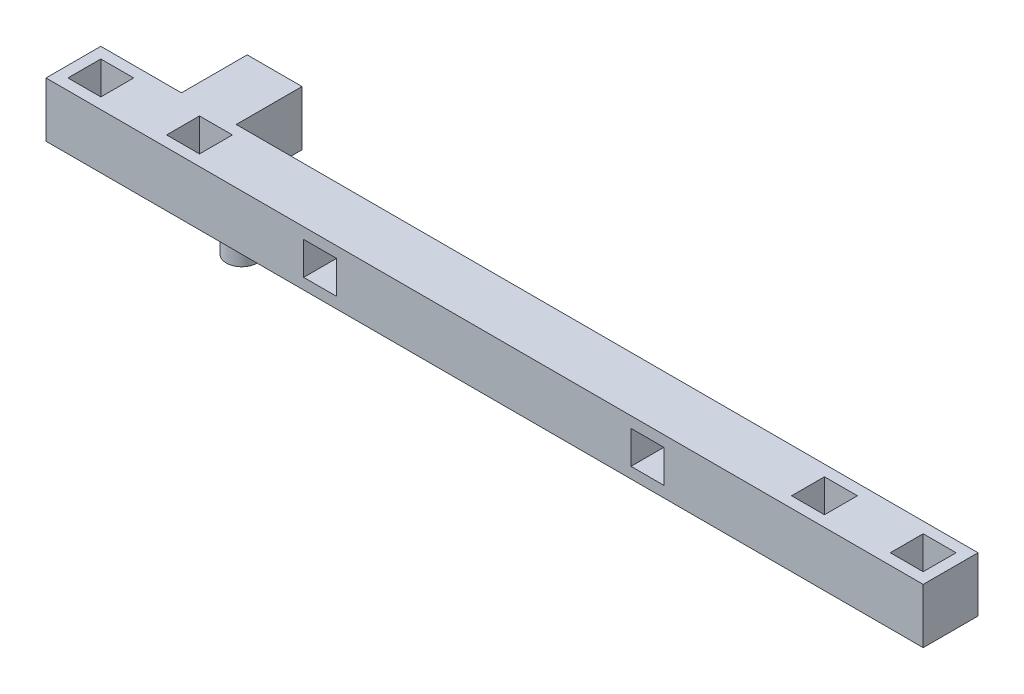
ISO-10303-21;
HEADER;
FILE_DESCRIPTION(('STEP AP214'),'2;1');
FILE_NAME('part.step','',(''),(''),'','','');
FILE_SCHEMA(('AUTOMOTIVE_DESIGN { 1 0 10303 214 1 1 1 1 }'));
ENDSEC;
DATA;
#1=APPLICATION_CONTEXT('core data for automotive mechanical design processes');
#2=APPLICATION_PROTOCOL_DEFINITION('international standard','automotive_design',2000,#1);
#3=PRODUCT_CONTEXT('',#1,'mechanical');
#4=PRODUCT('Part','Part','',(#3));
#5=PRODUCT_RELATED_PRODUCT_CATEGORY('part','',(#4));
#6=PRODUCT_DEFINITION_FORMATION('','',#4);
#7=PRODUCT_DEFINITION_CONTEXT('part definition',#1,'design');
#8=PRODUCT_DEFINITION('design','',#6,#7);
#9=PRODUCT_DEFINITION_SHAPE('','',#8);
#10=(LENGTH_UNIT() NAMED_UNIT(*) SI_UNIT(.MILLI.,.METRE.));
#11=(NAMED_UNIT(*) PLANE_ANGLE_UNIT() SI_UNIT($,.RADIAN.));
#12=(NAMED_UNIT(*) SI_UNIT($,.STERADIAN.) SOLID_ANGLE_UNIT());
#13=UNCERTAINTY_MEASURE_WITH_UNIT(LENGTH_MEASURE(1.E-05),#10,'distance_accuracy_value','');
#14=(GEOMETRIC_REPRESENTATION_CONTEXT(3) GLOBAL_UNCERTAINTY_ASSIGNED_CONTEXT((#13)) GLOBAL_UNIT_ASSIGNED_CONTEXT((#10,
#11,#12)) REPRESENTATION_CONTEXT('',''));
#15=CARTESIAN_POINT('',(0.,0.,0.));
#16=DIRECTION('',(0.,0.,1.));
#17=DIRECTION('',(1.,0.,0.));
#18=AXIS2_PLACEMENT_3D('',#15,#16,#17);
#19=CARTESIAN_POINT('',(0.,0.,0.));
#20=DIRECTION('',(0.,0.,-1.));
#21=DIRECTION('',(-1.,0.,0.));
#22=AXIS2_PLACEMENT_3D('',#19,#20,#21);
#23=PLANE('',#22);
#24=DIRECTION('',(0.,-1.,0.));
#25=VECTOR('',#24,1.);
#26=CARTESIAN_POINT('',(12.35,5.,0.));
#27=LINE('',#26,#25);
#28=CARTESIAN_POINT('',(12.35,5.,0.));
#29=VERTEX_POINT('',#28);
#30=CARTESIAN_POINT('',(12.35,0.,0.));
#31=VERTEX_POINT('',#30);
#32=EDGE_CURVE('E263',#29,#31,#27,.T.);
#33=ORIENTED_EDGE('',*,*,#32,.F.);
#34=DIRECTION('',(-1.,0.,0.));
#35=VECTOR('',#34,1.);
#36=CARTESIAN_POINT('',(0.,5.,0.));
#37=LINE('',#36,#35);
#38=CARTESIAN_POINT('',(80.,5.,0.));
#39=VERTEX_POINT('',#38);
#40=EDGE_CURVE('E464',#39,#29,#37,.T.);
#41=ORIENTED_EDGE('',*,*,#40,.F.);
#42=DIRECTION('',(0.,1.,0.));
#43=VECTOR('',#42,1.);
#44=CARTESIAN_POINT('',(80.,0.,0.));
#45=LINE('',#44,#43);
#46=CARTESIAN_POINT('',(80.,0.,0.));
#47=VERTEX_POINT('',#46);
#48=EDGE_CURVE('E475',#47,#39,#45,.T.);
#49=ORIENTED_EDGE('',*,*,#48,.F.);
#50=DIRECTION('',(1.,0.,0.));
#51=VECTOR('',#50,1.);
#52=CARTESIAN_POINT('',(0.,0.,0.));
#53=LINE('',#52,#51);
#54=EDGE_CURVE('E48',#31,#47,#53,.T.);
#55=ORIENTED_EDGE('',*,*,#54,.F.);
#56=EDGE_LOOP('',(#33,#41,#49,#55));
#57=FACE_BOUND('',#56,.T.);
#58=DIRECTION('',(-1.,0.,0.));
#59=VECTOR('',#58,1.);
#60=CARTESIAN_POINT('',(53.35,4.,0.));
#61=LINE('',#60,#59);
#62=CARTESIAN_POINT('',(56.35,4.,0.));
#63=VERTEX_POINT('',#62);
#64=CARTESIAN_POINT('',(53.35,4.,0.));
#65=VERTEX_POINT('',#64);
#66=EDGE_CURVE('E432',#63,#65,#61,.T.);
#67=ORIENTED_EDGE('',*,*,#66,.T.);
#68=DIRECTION('',(0.,-1.,0.));
#69=VECTOR('',#68,1.);
#70=CARTESIAN_POINT('',(53.35,4.,0.));
#71=LINE('',#70,#69);
#72=CARTESIAN_POINT('',(53.35,1.,0.));
#73=VERTEX_POINT('',#72);
#74=EDGE_CURVE('E428',#65,#73,#71,.T.);
#75=ORIENTED_EDGE('',*,*,#74,.T.);
#76=DIRECTION('',(1.,0.,0.));
#77=VECTOR('',#76,1.);
#78=CARTESIAN_POINT('',(53.35,1.,0.));
#79=LINE('',#78,#77);
#80=CARTESIAN_POINT('',(56.35,1.,0.));
#81=VERTEX_POINT('',#80);
#82=EDGE_CURVE('E442',#73,#81,#79,.T.);
#83=ORIENTED_EDGE('',*,*,#82,.T.);
#84=DIRECTION('',(0.,1.,0.));
#85=VECTOR('',#84,1.);
#86=CARTESIAN_POINT('',(56.35,4.,0.));
#87=LINE('',#86,#85);
#88=EDGE_CURVE('E445',#81,#63,#87,.T.);
#89=ORIENTED_EDGE('',*,*,#88,.T.);
#90=EDGE_LOOP('',(#67,#75,#83,#89));
#91=FACE_BOUND('',#90,.T.);
#92=DIRECTION('',(-1.,0.,0.));
#93=VECTOR('',#92,1.);
#94=CARTESIAN_POINT('',(23.5,4.,0.));
#95=LINE('',#94,#93);
#96=CARTESIAN_POINT('',(26.5,4.,0.));
#97=VERTEX_POINT('',#96);
#98=CARTESIAN_POINT('',(23.5,4.,0.));
#99=VERTEX_POINT('',#98);
#100=EDGE_CURVE('E401',#97,#99,#95,.T.);
#101=ORIENTED_EDGE('',*,*,#100,.T.);
#102=DIRECTION('',(0.,-1.,0.));
#103=VECTOR('',#102,1.);
#104=CARTESIAN_POINT('',(23.5,4.,0.));
#105=LINE('',#104,#103);
#106=CARTESIAN_POINT('',(23.5,1.,0.));
#107=VERTEX_POINT('',#106);
#108=EDGE_CURVE('E299',#99,#107,#105,.T.);
#109=ORIENTED_EDGE('',*,*,#108,.T.);
#110=DIRECTION('',(1.,0.,0.));
#111=VECTOR('',#110,1.);
#112=CARTESIAN_POINT('',(23.5,1.,0.));
#113=LINE('',#112,#111);
#114=CARTESIAN_POINT('',(26.5,1.,0.));
#115=VERTEX_POINT('',#114);
#116=EDGE_CURVE('E411',#107,#115,#113,.T.);
#117=ORIENTED_EDGE('',*,*,#116,.T.);
#118=DIRECTION('',(0.,1.,0.));
#119=VECTOR('',#118,1.);
#120=CARTESIAN_POINT('',(26.5,4.,0.));
#121=LINE('',#120,#119);
#122=EDGE_CURVE('E414',#115,#97,#121,.T.);
#123=ORIENTED_EDGE('',*,*,#122,.T.);
#124=EDGE_LOOP('',(#101,#109,#117,#123));
#125=FACE_BOUND('',#124,.T.);
#126=ADVANCED_FACE('F33',(#57,#91,#125),#23,.T.);
#127=CARTESIAN_POINT('',(0.,0.,5.));
#128=DIRECTION('',(0.,0.,-1.));
#129=DIRECTION('',(-1.,0.,0.));
#130=AXIS2_PLACEMENT_3D('',#127,#128,#129);
#131=PLANE('',#130);
#132=DIRECTION('',(0.,-1.,0.));
#133=VECTOR('',#132,1.);
#134=CARTESIAN_POINT('',(53.35,4.,5.));
#135=LINE('',#134,#133);
#136=CARTESIAN_POINT('',(53.35,4.,5.));
#137=VERTEX_POINT('',#136);
#138=CARTESIAN_POINT('',(53.35,1.,5.));
#139=VERTEX_POINT('',#138);
#140=EDGE_CURVE('E429',#137,#139,#135,.T.);
#141=ORIENTED_EDGE('',*,*,#140,.F.);
#142=DIRECTION('',(-1.,0.,0.));
#143=VECTOR('',#142,1.);
#144=CARTESIAN_POINT('',(53.35,4.,5.));
#145=LINE('',#144,#143);
#146=CARTESIAN_POINT('',(56.35,4.,5.));
#147=VERTEX_POINT('',#146);
#148=EDGE_CURVE('E437',#147,#137,#145,.T.);
#149=ORIENTED_EDGE('',*,*,#148,.F.);
#150=DIRECTION('',(0.,1.,0.));
#151=VECTOR('',#150,1.);
#152=CARTESIAN_POINT('',(56.35,4.,5.));
#153=LINE('',#152,#151);
#154=CARTESIAN_POINT('',(56.35,1.,5.));
#155=VERTEX_POINT('',#154);
#156=EDGE_CURVE('E434',#155,#147,#153,.T.);
#157=ORIENTED_EDGE('',*,*,#156,.F.);
#158=DIRECTION('',(1.,0.,0.));
#159=VECTOR('',#158,1.);
#160=CARTESIAN_POINT('',(53.35,1.,5.));
#161=LINE('',#160,#159);
#162=EDGE_CURVE('E431',#139,#155,#161,.T.);
#163=ORIENTED_EDGE('',*,*,#162,.F.);
#164=EDGE_LOOP('',(#141,#149,#157,#163));
#165=FACE_BOUND('',#164,.T.);
#166=DIRECTION('',(0.,-1.,0.));
#167=VECTOR('',#166,1.);
#168=CARTESIAN_POINT('',(0.,0.,5.));
#169=LINE('',#168,#167);
#170=CARTESIAN_POINT('',(0.,5.,5.));
#171=VERTEX_POINT('',#170);
#172=CARTESIAN_POINT('',(0.,0.,5.));
#173=VERTEX_POINT('',#172);
#174=EDGE_CURVE('E460',#171,#173,#169,.T.);
#175=ORIENTED_EDGE('',*,*,#174,.T.);
#176=DIRECTION('',(1.,0.,0.));
#177=VECTOR('',#176,1.);
#178=CARTESIAN_POINT('',(0.,0.,5.));
#179=LINE('',#178,#177);
#180=CARTESIAN_POINT('',(80.,0.,5.));
#181=VERTEX_POINT('',#180);
#182=EDGE_CURVE('E463',#173,#181,#179,.T.);
#183=ORIENTED_EDGE('',*,*,#182,.T.);
#184=DIRECTION('',(0.,1.,0.));
#185=VECTOR('',#184,1.);
#186=CARTESIAN_POINT('',(80.,0.,5.));
#187=LINE('',#186,#185);
#188=CARTESIAN_POINT('',(80.,5.,5.));
#189=VERTEX_POINT('',#188);
#190=EDGE_CURVE('E466',#181,#189,#187,.T.);
#191=ORIENTED_EDGE('',*,*,#190,.T.);
#192=DIRECTION('',(-1.,0.,0.));
#193=VECTOR('',#192,1.);
#194=CARTESIAN_POINT('',(0.,5.,5.));
#195=LINE('',#194,#193);
#196=EDGE_CURVE('E468',#189,#171,#195,.T.);
#197=ORIENTED_EDGE('',*,*,#196,.T.);
#198=EDGE_LOOP('',(#175,#183,#191,#197));
#199=FACE_BOUND('',#198,.T.);
#200=DIRECTION('',(0.,-1.,0.));
#201=VECTOR('',#200,1.);
#202=CARTESIAN_POINT('',(23.5,4.,5.));
#203=LINE('',#202,#201);
#204=CARTESIAN_POINT('',(23.5,4.,5.));
#205=VERTEX_POINT('',#204);
#206=CARTESIAN_POINT('',(23.5,1.,5.));
#207=VERTEX_POINT('',#206);
#208=EDGE_CURVE('E398',#205,#207,#203,.T.);
#209=ORIENTED_EDGE('',*,*,#208,.F.);
#210=DIRECTION('',(-1.,0.,0.));
#211=VECTOR('',#210,1.);
#212=CARTESIAN_POINT('',(23.5,4.,5.));
#213=LINE('',#212,#211);
#214=CARTESIAN_POINT('',(26.5,4.,5.));
#215=VERTEX_POINT('',#214);
#216=EDGE_CURVE('E406',#215,#205,#213,.T.);
#217=ORIENTED_EDGE('',*,*,#216,.F.);
#218=DIRECTION('',(0.,1.,0.));
#219=VECTOR('',#218,1.);
#220=CARTESIAN_POINT('',(26.5,4.,5.));
#221=LINE('',#220,#219);
#222=CARTESIAN_POINT('',(26.5,1.,5.));
#223=VERTEX_POINT('',#222);
#224=EDGE_CURVE('E403',#223,#215,#221,.T.);
#225=ORIENTED_EDGE('',*,*,#224,.F.);
#226=DIRECTION('',(1.,0.,0.));
#227=VECTOR('',#226,1.);
#228=CARTESIAN_POINT('',(23.5,1.,5.));
#229=LINE('',#228,#227);
#230=EDGE_CURVE('E400',#207,#223,#229,.T.);
#231=ORIENTED_EDGE('',*,*,#230,.F.);
#232=EDGE_LOOP('',(#209,#217,#225,#231));
#233=FACE_BOUND('',#232,.T.);
#234=ADVANCED_FACE('F564',(#165,#199,#233),#131,.F.);
#235=DIRECTION('',(0.,1.,0.));
#236=VECTOR('',#235,1.);
#237=CARTESIAN_POINT('',(7.35,5.,0.));
#238=LINE('',#237,#236);
#239=CARTESIAN_POINT('',(7.35,0.,0.));
#240=VERTEX_POINT('',#239);
#241=CARTESIAN_POINT('',(7.35,5.,0.));
#242=VERTEX_POINT('',#241);
#243=EDGE_CURVE('E56',#240,#242,#238,.T.);
#244=ORIENTED_EDGE('',*,*,#243,.F.);
#245=CARTESIAN_POINT('',(0.,0.,0.));
#246=VERTEX_POINT('',#245);
#247=EDGE_CURVE('E473',#246,#240,#53,.T.);
#248=ORIENTED_EDGE('',*,*,#247,.F.);
#249=DIRECTION('',(0.,-1.,0.));
#250=VECTOR('',#249,1.);
#251=CARTESIAN_POINT('',(0.,0.,0.));
#252=LINE('',#251,#250);
#253=CARTESIAN_POINT('',(0.,5.,0.));
#254=VERTEX_POINT('',#253);
#255=EDGE_CURVE('E459',#254,#246,#252,.T.);
#256=ORIENTED_EDGE('',*,*,#255,.F.);
#257=EDGE_CURVE('E477',#242,#254,#37,.T.);
#258=ORIENTED_EDGE('',*,*,#257,.F.);
#259=EDGE_LOOP('',(#244,#248,#256,#258));
#260=FACE_BOUND('',#259,.T.);
#261=ADVANCED_FACE('F494',(#260),#23,.T.);
#262=CARTESIAN_POINT('',(0.,0.,5.));
#263=DIRECTION('',(1.,0.,0.));
#264=DIRECTION('',(0.,0.,-1.));
#265=AXIS2_PLACEMENT_3D('',#262,#263,#264);
#266=PLANE('',#265);
#267=ORIENTED_EDGE('',*,*,#255,.T.);
#268=DIRECTION('',(0.,0.,-1.));
#269=VECTOR('',#268,1.);
#270=CARTESIAN_POINT('',(0.,0.,5.));
#271=LINE('',#270,#269);
#272=EDGE_CURVE('E41',#173,#246,#271,.T.);
#273=ORIENTED_EDGE('',*,*,#272,.F.);
#274=ORIENTED_EDGE('',*,*,#174,.F.);
#275=DIRECTION('',(0.,0.,-1.));
#276=VECTOR('',#275,1.);
#277=CARTESIAN_POINT('',(0.,5.,5.));
#278=LINE('',#277,#276);
#279=EDGE_CURVE('E470',#171,#254,#278,.T.);
#280=ORIENTED_EDGE('',*,*,#279,.T.);
#281=EDGE_LOOP('',(#267,#273,#274,#280));
#282=FACE_BOUND('',#281,.T.);
#283=ADVANCED_FACE('F35',(#282),#266,.F.);
#284=CARTESIAN_POINT('',(0.,0.,5.));
#285=DIRECTION('',(0.,1.,0.));
#286=DIRECTION('',(0.,0.,1.));
#287=AXIS2_PLACEMENT_3D('',#284,#285,#286);
#288=PLANE('',#287);
#289=CARTESIAN_POINT('',(9.85,0.,-3.));
#290=DIRECTION('',(0.,1.,0.));
#291=DIRECTION('',(0.,0.,1.));
#292=AXIS2_PLACEMENT_3D('',#289,#290,#291);
#293=CIRCLE('',#292,1.4);
#294=CARTESIAN_POINT('',(9.85,0.,-1.6));
#295=VERTEX_POINT('',#294);
#296=EDGE_CURVE('E11',#295,#295,#293,.F.);
#297=ORIENTED_EDGE('',*,*,#296,.F.);
#298=EDGE_LOOP('',(#297));
#299=FACE_BOUND('',#298,.T.);
#300=DIRECTION('',(-1.,0.,0.));
#301=VECTOR('',#300,1.);
#302=CARTESIAN_POINT('',(76.,0.,1.));
#303=LINE('',#302,#301);
#304=CARTESIAN_POINT('',(79.,0.,1.));
#305=VERTEX_POINT('',#304);
#306=CARTESIAN_POINT('',(76.,0.,1.));
#307=VERTEX_POINT('',#306);
#308=EDGE_CURVE('E282',#305,#307,#303,.T.);
#309=ORIENTED_EDGE('',*,*,#308,.T.);
#310=DIRECTION('',(0.,0.,1.));
#311=VECTOR('',#310,1.);
#312=CARTESIAN_POINT('',(76.,0.,1.));
#313=LINE('',#312,#311);
#314=CARTESIAN_POINT('',(76.,0.,4.));
#315=VERTEX_POINT('',#314);
#316=EDGE_CURVE('E272',#307,#315,#313,.T.);
#317=ORIENTED_EDGE('',*,*,#316,.T.);
#318=DIRECTION('',(1.,0.,0.));
#319=VECTOR('',#318,1.);
#320=CARTESIAN_POINT('',(76.,0.,4.));
#321=LINE('',#320,#319);
#322=CARTESIAN_POINT('',(79.,0.,4.));
#323=VERTEX_POINT('',#322);
#324=EDGE_CURVE('E275',#315,#323,#321,.T.);
#325=ORIENTED_EDGE('',*,*,#324,.T.);
#326=DIRECTION('',(0.,0.,-1.));
#327=VECTOR('',#326,1.);
#328=CARTESIAN_POINT('',(79.,0.,1.));
#329=LINE('',#328,#327);
#330=EDGE_CURVE('E279',#323,#305,#329,.T.);
#331=ORIENTED_EDGE('',*,*,#330,.T.);
#332=EDGE_LOOP('',(#309,#317,#325,#331));
#333=FACE_BOUND('',#332,.T.);
#334=DIRECTION('',(-1.,0.,0.));
#335=VECTOR('',#334,1.);
#336=CARTESIAN_POINT('',(1.,0.,1.));
#337=LINE('',#336,#335);
#338=CARTESIAN_POINT('',(4.,0.,0.999999999999991));
#339=VERTEX_POINT('',#338);
#340=CARTESIAN_POINT('',(1.,0.,1.));
#341=VERTEX_POINT('',#340);
#342=EDGE_CURVE('E316',#339,#341,#337,.T.);
#343=ORIENTED_EDGE('',*,*,#342,.T.);
#344=DIRECTION('',(0.,0.,1.));
#345=VECTOR('',#344,1.);
#346=CARTESIAN_POINT('',(1.,0.,1.));
#347=LINE('',#346,#345);
#348=CARTESIAN_POINT('',(1.,0.,4.));
#349=VERTEX_POINT('',#348);
#350=EDGE_CURVE('E306',#341,#349,#347,.T.);
#351=ORIENTED_EDGE('',*,*,#350,.T.);
#352=DIRECTION('',(1.,0.,0.));
#353=VECTOR('',#352,1.);
#354=CARTESIAN_POINT('',(1.,0.,4.));
#355=LINE('',#354,#353);
#356=CARTESIAN_POINT('',(4.,0.,4.));
#357=VERTEX_POINT('',#356);
#358=EDGE_CURVE('E309',#349,#357,#355,.T.);
#359=ORIENTED_EDGE('',*,*,#358,.T.);
#360=DIRECTION('',(0.,0.,-1.));
#361=VECTOR('',#360,1.);
#362=CARTESIAN_POINT('',(4.,0.,0.999999999999991));
#363=LINE('',#362,#361);
#364=EDGE_CURVE('E313',#357,#339,#363,.T.);
#365=ORIENTED_EDGE('',*,*,#364,.T.);
#366=EDGE_LOOP('',(#343,#351,#359,#365));
#367=FACE_BOUND('',#366,.T.);
#368=DIRECTION('',(-1.,0.,0.));
#369=VECTOR('',#368,1.);
#370=CARTESIAN_POINT('',(10.,0.,1.));
#371=LINE('',#370,#369);
#372=CARTESIAN_POINT('',(13.,0.,1.));
#373=VERTEX_POINT('',#372);
#374=CARTESIAN_POINT('',(10.,0.,1.));
#375=VERTEX_POINT('',#374);
#376=EDGE_CURVE('E348',#373,#375,#371,.T.);
#377=ORIENTED_EDGE('',*,*,#376,.T.);
#378=DIRECTION('',(0.,0.,1.));
#379=VECTOR('',#378,1.);
#380=CARTESIAN_POINT('',(10.,0.,1.));
#381=LINE('',#380,#379);
#382=CARTESIAN_POINT('',(10.,0.,4.));
#383=VERTEX_POINT('',#382);
#384=EDGE_CURVE('E338',#375,#383,#381,.T.);
#385=ORIENTED_EDGE('',*,*,#384,.T.);
#386=DIRECTION('',(1.,0.,0.));
#387=VECTOR('',#386,1.);
#388=CARTESIAN_POINT('',(10.,0.,4.));
#389=LINE('',#388,#387);
#390=CARTESIAN_POINT('',(13.,0.,4.));
#391=VERTEX_POINT('',#390);
#392=EDGE_CURVE('E341',#383,#391,#389,.T.);
#393=ORIENTED_EDGE('',*,*,#392,.T.);
#394=DIRECTION('',(0.,0.,-1.));
#395=VECTOR('',#394,1.);
#396=CARTESIAN_POINT('',(13.,0.,1.));
#397=LINE('',#396,#395);
#398=EDGE_CURVE('E345',#391,#373,#397,.T.);
#399=ORIENTED_EDGE('',*,*,#398,.T.);
#400=EDGE_LOOP('',(#377,#385,#393,#399));
#401=FACE_BOUND('',#400,.T.);
#402=DIRECTION('',(-1.,0.,0.));
#403=VECTOR('',#402,1.);
#404=CARTESIAN_POINT('',(67.,0.,1.));
#405=LINE('',#404,#403);
#406=CARTESIAN_POINT('',(70.,0.,1.));
#407=VERTEX_POINT('',#406);
#408=CARTESIAN_POINT('',(67.,0.,1.));
#409=VERTEX_POINT('',#408);
#410=EDGE_CURVE('E380',#407,#409,#405,.T.);
#411=ORIENTED_EDGE('',*,*,#410,.T.);
#412=DIRECTION('',(0.,0.,1.));
#413=VECTOR('',#412,1.);
#414=CARTESIAN_POINT('',(67.,0.,1.));
#415=LINE('',#414,#413);
#416=CARTESIAN_POINT('',(67.,0.,4.));
#417=VERTEX_POINT('',#416);
#418=EDGE_CURVE('E370',#409,#417,#415,.T.);
#419=ORIENTED_EDGE('',*,*,#418,.T.);
#420=DIRECTION('',(1.,0.,0.));
#421=VECTOR('',#420,1.);
#422=CARTESIAN_POINT('',(67.,0.,4.));
#423=LINE('',#422,#421);
#424=CARTESIAN_POINT('',(70.,0.,4.));
#425=VERTEX_POINT('',#424);
#426=EDGE_CURVE('E373',#417,#425,#423,.T.);
#427=ORIENTED_EDGE('',*,*,#426,.T.);
#428=DIRECTION('',(0.,0.,-1.));
#429=VECTOR('',#428,1.);
#430=CARTESIAN_POINT('',(70.,0.,1.));
#431=LINE('',#430,#429);
#432=EDGE_CURVE('E377',#425,#407,#431,.T.);
#433=ORIENTED_EDGE('',*,*,#432,.T.);
#434=EDGE_LOOP('',(#411,#419,#427,#433));
#435=FACE_BOUND('',#434,.T.);
#436=ORIENTED_EDGE('',*,*,#247,.T.);
#437=DIRECTION('',(0.,0.,1.));
#438=VECTOR('',#437,1.);
#439=CARTESIAN_POINT('',(7.35,0.,-6.));
#440=LINE('',#439,#438);
#441=CARTESIAN_POINT('',(7.35,0.,-6.));
#442=VERTEX_POINT('',#441);
#443=EDGE_CURVE('E248',#442,#240,#440,.T.);
#444=ORIENTED_EDGE('',*,*,#443,.F.);
#445=DIRECTION('',(-1.,0.,0.));
#446=VECTOR('',#445,1.);
#447=CARTESIAN_POINT('',(12.35,0.,-6.));
#448=LINE('',#447,#446);
#449=CARTESIAN_POINT('',(12.35,0.,-6.));
#450=VERTEX_POINT('',#449);
#451=EDGE_CURVE('E241',#450,#442,#448,.T.);
#452=ORIENTED_EDGE('',*,*,#451,.F.);
#453=DIRECTION('',(0.,0.,1.));
#454=VECTOR('',#453,1.);
#455=CARTESIAN_POINT('',(12.35,0.,-6.));
#456=LINE('',#455,#454);
#457=EDGE_CURVE('E245',#450,#31,#456,.T.);
#458=ORIENTED_EDGE('',*,*,#457,.T.);
#459=ORIENTED_EDGE('',*,*,#54,.T.);
#460=DIRECTION('',(0.,0.,-1.));
#461=VECTOR('',#460,1.);
#462=CARTESIAN_POINT('',(80.,0.,5.));
#463=LINE('',#462,#461);
#464=EDGE_CURVE('E485',#181,#47,#463,.T.);
#465=ORIENTED_EDGE('',*,*,#464,.F.);
#466=ORIENTED_EDGE('',*,*,#182,.F.);
#467=ORIENTED_EDGE('',*,*,#272,.T.);
#468=EDGE_LOOP('',(#436,#444,#452,#458,#459,#465,#466,#467));
#469=FACE_BOUND('',#468,.T.);
#470=ADVANCED_FACE('F243',(#299,#333,#367,#401,#435,#469),#288,.F.);
#471=CARTESIAN_POINT('',(80.,0.,5.));
#472=DIRECTION('',(-1.,0.,0.));
#473=DIRECTION('',(0.,0.,1.));
#474=AXIS2_PLACEMENT_3D('',#471,#472,#473);
#475=PLANE('',#474);
#476=ORIENTED_EDGE('',*,*,#48,.T.);
#477=DIRECTION('',(0.,0.,-1.));
#478=VECTOR('',#477,1.);
#479=CARTESIAN_POINT('',(80.,5.,5.));
#480=LINE('',#479,#478);
#481=EDGE_CURVE('E482',#189,#39,#480,.T.);
#482=ORIENTED_EDGE('',*,*,#481,.F.);
#483=ORIENTED_EDGE('',*,*,#190,.F.);
#484=ORIENTED_EDGE('',*,*,#464,.T.);
#485=EDGE_LOOP('',(#476,#482,#483,#484));
#486=FACE_BOUND('',#485,.T.);
#487=ADVANCED_FACE('F522',(#486),#475,.F.);
#488=CARTESIAN_POINT('',(0.,5.,5.));
#489=DIRECTION('',(0.,-1.,0.));
#490=DIRECTION('',(0.,0.,-1.));
#491=AXIS2_PLACEMENT_3D('',#488,#489,#490);
#492=PLANE('',#491);
#493=DIRECTION('',(1.,0.,0.));
#494=VECTOR('',#493,1.);
#495=CARTESIAN_POINT('',(76.,5.,4.));
#496=LINE('',#495,#494);
#497=CARTESIAN_POINT('',(76.,5.,4.));
#498=VERTEX_POINT('',#497);
#499=CARTESIAN_POINT('',(79.,5.,4.));
#500=VERTEX_POINT('',#499);
#501=EDGE_CURVE('E288',#498,#500,#496,.T.);
#502=ORIENTED_EDGE('',*,*,#501,.F.);
#503=DIRECTION('',(0.,0.,1.));
#504=VECTOR('',#503,1.);
#505=CARTESIAN_POINT('',(76.,5.,1.));
#506=LINE('',#505,#504);
#507=CARTESIAN_POINT('',(76.,5.,1.));
#508=VERTEX_POINT('',#507);
#509=EDGE_CURVE('E286',#508,#498,#506,.T.);
#510=ORIENTED_EDGE('',*,*,#509,.F.);
#511=DIRECTION('',(-1.,0.,0.));
#512=VECTOR('',#511,1.);
#513=CARTESIAN_POINT('',(76.,5.,1.));
#514=LINE('',#513,#512);
#515=CARTESIAN_POINT('',(79.,5.,1.));
#516=VERTEX_POINT('',#515);
#517=EDGE_CURVE('E276',#516,#508,#514,.T.);
#518=ORIENTED_EDGE('',*,*,#517,.F.);
#519=DIRECTION('',(0.,0.,-1.));
#520=VECTOR('',#519,1.);
#521=CARTESIAN_POINT('',(79.,5.,1.));
#522=LINE('',#521,#520);
#523=EDGE_CURVE('E292',#500,#516,#522,.T.);
#524=ORIENTED_EDGE('',*,*,#523,.F.);
#525=EDGE_LOOP('',(#502,#510,#518,#524));
#526=FACE_BOUND('',#525,.T.);
#527=DIRECTION('',(1.,0.,0.));
#528=VECTOR('',#527,1.);
#529=CARTESIAN_POINT('',(1.,5.,4.));
#530=LINE('',#529,#528);
#531=CARTESIAN_POINT('',(1.,5.,4.));
#532=VERTEX_POINT('',#531);
#533=CARTESIAN_POINT('',(4.,5.,4.));
#534=VERTEX_POINT('',#533);
#535=EDGE_CURVE('E322',#532,#534,#530,.T.);
#536=ORIENTED_EDGE('',*,*,#535,.F.);
#537=DIRECTION('',(0.,0.,1.));
#538=VECTOR('',#537,1.);
#539=CARTESIAN_POINT('',(1.,5.,1.));
#540=LINE('',#539,#538);
#541=CARTESIAN_POINT('',(1.,5.,1.));
#542=VERTEX_POINT('',#541);
#543=EDGE_CURVE('E320',#542,#532,#540,.T.);
#544=ORIENTED_EDGE('',*,*,#543,.F.);
#545=DIRECTION('',(-1.,0.,0.));
#546=VECTOR('',#545,1.);
#547=CARTESIAN_POINT('',(1.,5.,1.));
#548=LINE('',#547,#546);
#549=CARTESIAN_POINT('',(4.,5.,0.999999999999991));
#550=VERTEX_POINT('',#549);
#551=EDGE_CURVE('E310',#550,#542,#548,.T.);
#552=ORIENTED_EDGE('',*,*,#551,.F.);
#553=DIRECTION('',(0.,0.,-1.));
#554=VECTOR('',#553,1.);
#555=CARTESIAN_POINT('',(4.,5.,0.999999999999991));
#556=LINE('',#555,#554);
#557=EDGE_CURVE('E326',#534,#550,#556,.T.);
#558=ORIENTED_EDGE('',*,*,#557,.F.);
#559=EDGE_LOOP('',(#536,#544,#552,#558));
#560=FACE_BOUND('',#559,.T.);
#561=DIRECTION('',(1.,0.,0.));
#562=VECTOR('',#561,1.);
#563=CARTESIAN_POINT('',(10.,5.,4.));
#564=LINE('',#563,#562);
#565=CARTESIAN_POINT('',(10.,5.,4.));
#566=VERTEX_POINT('',#565);
#567=CARTESIAN_POINT('',(13.,5.,4.));
#568=VERTEX_POINT('',#567);
#569=EDGE_CURVE('E354',#566,#568,#564,.T.);
#570=ORIENTED_EDGE('',*,*,#569,.F.);
#571=DIRECTION('',(0.,0.,1.));
#572=VECTOR('',#571,1.);
#573=CARTESIAN_POINT('',(10.,5.,1.));
#574=LINE('',#573,#572);
#575=CARTESIAN_POINT('',(10.,5.,1.));
#576=VERTEX_POINT('',#575);
#577=EDGE_CURVE('E352',#576,#566,#574,.T.);
#578=ORIENTED_EDGE('',*,*,#577,.F.);
#579=DIRECTION('',(-1.,0.,0.));
#580=VECTOR('',#579,1.);
#581=CARTESIAN_POINT('',(10.,5.,1.));
#582=LINE('',#581,#580);
#583=CARTESIAN_POINT('',(13.,5.,1.));
#584=VERTEX_POINT('',#583);
#585=EDGE_CURVE('E342',#584,#576,#582,.T.);
#586=ORIENTED_EDGE('',*,*,#585,.F.);
#587=DIRECTION('',(0.,0.,-1.));
#588=VECTOR('',#587,1.);
#589=CARTESIAN_POINT('',(13.,5.,1.));
#590=LINE('',#589,#588);
#591=EDGE_CURVE('E358',#568,#584,#590,.T.);
#592=ORIENTED_EDGE('',*,*,#591,.F.);
#593=EDGE_LOOP('',(#570,#578,#586,#592));
#594=FACE_BOUND('',#593,.T.);
#595=DIRECTION('',(1.,0.,0.));
#596=VECTOR('',#595,1.);
#597=CARTESIAN_POINT('',(67.,5.,4.));
#598=LINE('',#597,#596);
#599=CARTESIAN_POINT('',(67.,5.,4.));
#600=VERTEX_POINT('',#599);
#601=CARTESIAN_POINT('',(70.,5.,4.));
#602=VERTEX_POINT('',#601);
#603=EDGE_CURVE('E266',#600,#602,#598,.T.);
#604=ORIENTED_EDGE('',*,*,#603,.F.);
#605=DIRECTION('',(0.,0.,1.));
#606=VECTOR('',#605,1.);
#607=CARTESIAN_POINT('',(67.,5.,1.));
#608=LINE('',#607,#606);
#609=CARTESIAN_POINT('',(67.,5.,1.));
#610=VERTEX_POINT('',#609);
#611=EDGE_CURVE('E264',#610,#600,#608,.T.);
#612=ORIENTED_EDGE('',*,*,#611,.F.);
#613=DIRECTION('',(-1.,0.,0.));
#614=VECTOR('',#613,1.);
#615=CARTESIAN_POINT('',(67.,5.,1.));
#616=LINE('',#615,#614);
#617=CARTESIAN_POINT('',(70.,5.,1.));
#618=VERTEX_POINT('',#617);
#619=EDGE_CURVE('E374',#618,#610,#616,.T.);
#620=ORIENTED_EDGE('',*,*,#619,.F.);
#621=DIRECTION('',(0.,0.,-1.));
#622=VECTOR('',#621,1.);
#623=CARTESIAN_POINT('',(70.,5.,1.));
#624=LINE('',#623,#622);
#625=EDGE_CURVE('E386',#602,#618,#624,.T.);
#626=ORIENTED_EDGE('',*,*,#625,.F.);
#627=EDGE_LOOP('',(#604,#612,#620,#626));
#628=FACE_BOUND('',#627,.T.);
#629=ORIENTED_EDGE('',*,*,#40,.T.);
#630=DIRECTION('',(0.,0.,1.));
#631=VECTOR('',#630,1.);
#632=CARTESIAN_POINT('',(12.35,5.,-6.));
#633=LINE('',#632,#631);
#634=CARTESIAN_POINT('',(12.35,5.,-6.));
#635=VERTEX_POINT('',#634);
#636=EDGE_CURVE('E502',#635,#29,#633,.T.);
#637=ORIENTED_EDGE('',*,*,#636,.F.);
#638=DIRECTION('',(1.,0.,0.));
#639=VECTOR('',#638,1.);
#640=CARTESIAN_POINT('',(12.35,5.,-6.));
#641=LINE('',#640,#639);
#642=CARTESIAN_POINT('',(7.35,5.,-6.));
#643=VERTEX_POINT('',#642);
#644=EDGE_CURVE('E257',#643,#635,#641,.T.);
#645=ORIENTED_EDGE('',*,*,#644,.F.);
#646=DIRECTION('',(0.,0.,1.));
#647=VECTOR('',#646,1.);
#648=CARTESIAN_POINT('',(7.35,5.,-6.));
#649=LINE('',#648,#647);
#650=EDGE_CURVE('E268',#643,#242,#649,.T.);
#651=ORIENTED_EDGE('',*,*,#650,.T.);
#652=ORIENTED_EDGE('',*,*,#257,.T.);
#653=ORIENTED_EDGE('',*,*,#279,.F.);
#654=ORIENTED_EDGE('',*,*,#196,.F.);
#655=ORIENTED_EDGE('',*,*,#481,.T.);
#656=EDGE_LOOP('',(#629,#637,#645,#651,#652,#653,#654,#655));
#657=FACE_BOUND('',#656,.T.);
#658=ADVANCED_FACE('F501',(#526,#560,#594,#628,#657),#492,.F.);
#659=CARTESIAN_POINT('',(53.35,4.,5.));
#660=DIRECTION('',(1.,0.,0.));
#661=DIRECTION('',(0.,0.,-1.));
#662=AXIS2_PLACEMENT_3D('',#659,#660,#661);
#663=PLANE('',#662);
#664=ORIENTED_EDGE('',*,*,#74,.F.);
#665=DIRECTION('',(0.,0.,-1.));
#666=VECTOR('',#665,1.);
#667=CARTESIAN_POINT('',(53.35,4.,5.));
#668=LINE('',#667,#666);
#669=EDGE_CURVE('E439',#137,#65,#668,.T.);
#670=ORIENTED_EDGE('',*,*,#669,.F.);
#671=ORIENTED_EDGE('',*,*,#140,.T.);
#672=DIRECTION('',(0.,0.,-1.));
#673=VECTOR('',#672,1.);
#674=CARTESIAN_POINT('',(53.35,1.,5.));
#675=LINE('',#674,#673);
#676=EDGE_CURVE('E456',#139,#73,#675,.T.);
#677=ORIENTED_EDGE('',*,*,#676,.T.);
#678=EDGE_LOOP('',(#664,#670,#671,#677));
#679=FACE_BOUND('',#678,.T.);
#680=ADVANCED_FACE('F547',(#679),#663,.T.);
#681=CARTESIAN_POINT('',(53.35,1.,5.));
#682=DIRECTION('',(0.,1.,0.));
#683=DIRECTION('',(-1.,0.,0.));
#684=AXIS2_PLACEMENT_3D('',#681,#682,#683);
#685=PLANE('',#684);
#686=ORIENTED_EDGE('',*,*,#82,.F.);
#687=ORIENTED_EDGE('',*,*,#676,.F.);
#688=ORIENTED_EDGE('',*,*,#162,.T.);
#689=DIRECTION('',(0.,0.,-1.));
#690=VECTOR('',#689,1.);
#691=CARTESIAN_POINT('',(56.35,1.,5.));
#692=LINE('',#691,#690);
#693=EDGE_CURVE('E454',#155,#81,#692,.T.);
#694=ORIENTED_EDGE('',*,*,#693,.T.);
#695=EDGE_LOOP('',(#686,#687,#688,#694));
#696=FACE_BOUND('',#695,.T.);
#697=ADVANCED_FACE('F554',(#696),#685,.T.);
#698=CARTESIAN_POINT('',(56.35,4.,5.));
#699=DIRECTION('',(-1.,0.,0.));
#700=DIRECTION('',(0.,0.,1.));
#701=AXIS2_PLACEMENT_3D('',#698,#699,#700);
#702=PLANE('',#701);
#703=ORIENTED_EDGE('',*,*,#88,.F.);
#704=ORIENTED_EDGE('',*,*,#693,.F.);
#705=ORIENTED_EDGE('',*,*,#156,.T.);
#706=DIRECTION('',(0.,0.,-1.));
#707=VECTOR('',#706,1.);
#708=CARTESIAN_POINT('',(56.35,4.,5.));
#709=LINE('',#708,#707);
#710=EDGE_CURVE('E452',#147,#63,#709,.T.);
#711=ORIENTED_EDGE('',*,*,#710,.T.);
#712=EDGE_LOOP('',(#703,#704,#705,#711));
#713=FACE_BOUND('',#712,.T.);
#714=ADVANCED_FACE('F595',(#713),#702,.T.);
#715=CARTESIAN_POINT('',(53.35,4.,5.));
#716=DIRECTION('',(0.,-1.,0.));
#717=DIRECTION('',(0.,0.,-1.));
#718=AXIS2_PLACEMENT_3D('',#715,#716,#717);
#719=PLANE('',#718);
#720=ORIENTED_EDGE('',*,*,#66,.F.);
#721=ORIENTED_EDGE('',*,*,#710,.F.);
#722=ORIENTED_EDGE('',*,*,#148,.T.);
#723=ORIENTED_EDGE('',*,*,#669,.T.);
#724=EDGE_LOOP('',(#720,#721,#722,#723));
#725=FACE_BOUND('',#724,.T.);
#726=ADVANCED_FACE('F603',(#725),#719,.T.);
#727=CARTESIAN_POINT('',(23.5,4.,5.));
#728=DIRECTION('',(1.,0.,0.));
#729=DIRECTION('',(0.,0.,-1.));
#730=AXIS2_PLACEMENT_3D('',#727,#728,#729);
#731=PLANE('',#730);
#732=ORIENTED_EDGE('',*,*,#108,.F.);
#733=DIRECTION('',(0.,0.,-1.));
#734=VECTOR('',#733,1.);
#735=CARTESIAN_POINT('',(23.5,4.,5.));
#736=LINE('',#735,#734);
#737=EDGE_CURVE('E408',#205,#99,#736,.T.);
#738=ORIENTED_EDGE('',*,*,#737,.F.);
#739=ORIENTED_EDGE('',*,*,#208,.T.);
#740=DIRECTION('',(0.,0.,-1.));
#741=VECTOR('',#740,1.);
#742=CARTESIAN_POINT('',(23.5,1.,5.));
#743=LINE('',#742,#741);
#744=EDGE_CURVE('E425',#207,#107,#743,.T.);
#745=ORIENTED_EDGE('',*,*,#744,.T.);
#746=EDGE_LOOP('',(#732,#738,#739,#745));
#747=FACE_BOUND('',#746,.T.);
#748=ADVANCED_FACE('F611',(#747),#731,.T.);
#749=CARTESIAN_POINT('',(23.5,1.,5.));
#750=DIRECTION('',(0.,1.,0.));
#751=DIRECTION('',(-1.,0.,0.));
#752=AXIS2_PLACEMENT_3D('',#749,#750,#751);
#753=PLANE('',#752);
#754=ORIENTED_EDGE('',*,*,#116,.F.);
#755=ORIENTED_EDGE('',*,*,#744,.F.);
#756=ORIENTED_EDGE('',*,*,#230,.T.);
#757=DIRECTION('',(0.,0.,-1.));
#758=VECTOR('',#757,1.);
#759=CARTESIAN_POINT('',(26.5,1.,5.));
#760=LINE('',#759,#758);
#761=EDGE_CURVE('E423',#223,#115,#760,.T.);
#762=ORIENTED_EDGE('',*,*,#761,.T.);
#763=EDGE_LOOP('',(#754,#755,#756,#762));
#764=FACE_BOUND('',#763,.T.);
#765=ADVANCED_FACE('F619',(#764),#753,.T.);
#766=CARTESIAN_POINT('',(26.5,4.,5.));
#767=DIRECTION('',(-1.,0.,0.));
#768=DIRECTION('',(0.,0.,1.));
#769=AXIS2_PLACEMENT_3D('',#766,#767,#768);
#770=PLANE('',#769);
#771=ORIENTED_EDGE('',*,*,#122,.F.);
#772=ORIENTED_EDGE('',*,*,#761,.F.);
#773=ORIENTED_EDGE('',*,*,#224,.T.);
#774=DIRECTION('',(0.,0.,-1.));
#775=VECTOR('',#774,1.);
#776=CARTESIAN_POINT('',(26.5,4.,5.));
#777=LINE('',#776,#775);
#778=EDGE_CURVE('E421',#215,#97,#777,.T.);
#779=ORIENTED_EDGE('',*,*,#778,.T.);
#780=EDGE_LOOP('',(#771,#772,#773,#779));
#781=FACE_BOUND('',#780,.T.);
#782=ADVANCED_FACE('F627',(#781),#770,.T.);
#783=CARTESIAN_POINT('',(23.5,4.,5.));
#784=DIRECTION('',(0.,-1.,0.));
#785=DIRECTION('',(0.,0.,-1.));
#786=AXIS2_PLACEMENT_3D('',#783,#784,#785);
#787=PLANE('',#786);
#788=ORIENTED_EDGE('',*,*,#100,.F.);
#789=ORIENTED_EDGE('',*,*,#778,.F.);
#790=ORIENTED_EDGE('',*,*,#216,.T.);
#791=ORIENTED_EDGE('',*,*,#737,.T.);
#792=EDGE_LOOP('',(#788,#789,#790,#791));
#793=FACE_BOUND('',#792,.T.);
#794=ADVANCED_FACE('F635',(#793),#787,.T.);
#795=CARTESIAN_POINT('',(67.,0.,1.));
#796=DIRECTION('',(-1.,0.,0.));
#797=DIRECTION('',(0.,0.,1.));
#798=AXIS2_PLACEMENT_3D('',#795,#796,#797);
#799=PLANE('',#798);
#800=ORIENTED_EDGE('',*,*,#611,.T.);
#801=DIRECTION('',(0.,1.,0.));
#802=VECTOR('',#801,1.);
#803=CARTESIAN_POINT('',(67.,0.,4.));
#804=LINE('',#803,#802);
#805=EDGE_CURVE('E382',#417,#600,#804,.T.);
#806=ORIENTED_EDGE('',*,*,#805,.F.);
#807=ORIENTED_EDGE('',*,*,#418,.F.);
#808=DIRECTION('',(0.,1.,0.));
#809=VECTOR('',#808,1.);
#810=CARTESIAN_POINT('',(67.,0.,1.));
#811=LINE('',#810,#809);
#812=EDGE_CURVE('E355',#409,#610,#811,.T.);
#813=ORIENTED_EDGE('',*,*,#812,.T.);
#814=EDGE_LOOP('',(#800,#806,#807,#813));
#815=FACE_BOUND('',#814,.T.);
#816=ADVANCED_FACE('F536',(#815),#799,.F.);
#817=CARTESIAN_POINT('',(67.,0.,1.));
#818=DIRECTION('',(0.,0.,-1.));
#819=DIRECTION('',(-1.,0.,0.));
#820=AXIS2_PLACEMENT_3D('',#817,#818,#819);
#821=PLANE('',#820);
#822=ORIENTED_EDGE('',*,*,#619,.T.);
#823=ORIENTED_EDGE('',*,*,#812,.F.);
#824=ORIENTED_EDGE('',*,*,#410,.F.);
#825=DIRECTION('',(0.,1.,0.));
#826=VECTOR('',#825,1.);
#827=CARTESIAN_POINT('',(70.,0.,1.));
#828=LINE('',#827,#826);
#829=EDGE_CURVE('E392',#407,#618,#828,.T.);
#830=ORIENTED_EDGE('',*,*,#829,.T.);
#831=EDGE_LOOP('',(#822,#823,#824,#830));
#832=FACE_BOUND('',#831,.T.);
#833=ADVANCED_FACE('F532',(#832),#821,.F.);
#834=CARTESIAN_POINT('',(70.,0.,1.));
#835=DIRECTION('',(1.,0.,0.));
#836=DIRECTION('',(0.,0.,-1.));
#837=AXIS2_PLACEMENT_3D('',#834,#835,#836);
#838=PLANE('',#837);
#839=ORIENTED_EDGE('',*,*,#625,.T.);
#840=ORIENTED_EDGE('',*,*,#829,.F.);
#841=ORIENTED_EDGE('',*,*,#432,.F.);
#842=DIRECTION('',(0.,1.,0.));
#843=VECTOR('',#842,1.);
#844=CARTESIAN_POINT('',(70.,0.,4.));
#845=LINE('',#844,#843);
#846=EDGE_CURVE('E394',#425,#602,#845,.T.);
#847=ORIENTED_EDGE('',*,*,#846,.T.);
#848=EDGE_LOOP('',(#839,#840,#841,#847));
#849=FACE_BOUND('',#848,.T.);
#850=ADVANCED_FACE('F544',(#849),#838,.F.);
#851=CARTESIAN_POINT('',(67.,0.,4.));
#852=DIRECTION('',(0.,0.,1.));
#853=DIRECTION('',(1.,0.,0.));
#854=AXIS2_PLACEMENT_3D('',#851,#852,#853);
#855=PLANE('',#854);
#856=ORIENTED_EDGE('',*,*,#603,.T.);
#857=ORIENTED_EDGE('',*,*,#846,.F.);
#858=ORIENTED_EDGE('',*,*,#426,.F.);
#859=ORIENTED_EDGE('',*,*,#805,.T.);
#860=EDGE_LOOP('',(#856,#857,#858,#859));
#861=FACE_BOUND('',#860,.T.);
#862=ADVANCED_FACE('F541',(#861),#855,.F.);
#863=CARTESIAN_POINT('',(10.,0.,1.));
#864=DIRECTION('',(-1.,0.,0.));
#865=DIRECTION('',(0.,0.,1.));
#866=AXIS2_PLACEMENT_3D('',#863,#864,#865);
#867=PLANE('',#866);
#868=ORIENTED_EDGE('',*,*,#577,.T.);
#869=DIRECTION('',(0.,1.,0.));
#870=VECTOR('',#869,1.);
#871=CARTESIAN_POINT('',(10.,0.,4.));
#872=LINE('',#871,#870);
#873=EDGE_CURVE('E351',#383,#566,#872,.T.);
#874=ORIENTED_EDGE('',*,*,#873,.F.);
#875=ORIENTED_EDGE('',*,*,#384,.F.);
#876=DIRECTION('',(0.,1.,0.));
#877=VECTOR('',#876,1.);
#878=CARTESIAN_POINT('',(10.,0.,1.));
#879=LINE('',#878,#877);
#880=EDGE_CURVE('E323',#375,#576,#879,.T.);
#881=ORIENTED_EDGE('',*,*,#880,.T.);
#882=EDGE_LOOP('',(#868,#874,#875,#881));
#883=FACE_BOUND('',#882,.T.);
#884=ADVANCED_FACE('F668',(#883),#867,.F.);
#885=CARTESIAN_POINT('',(10.,0.,1.));
#886=DIRECTION('',(0.,0.,-1.));
#887=DIRECTION('',(-1.,0.,0.));
#888=AXIS2_PLACEMENT_3D('',#885,#886,#887);
#889=PLANE('',#888);
#890=ORIENTED_EDGE('',*,*,#585,.T.);
#891=ORIENTED_EDGE('',*,*,#880,.F.);
#892=ORIENTED_EDGE('',*,*,#376,.F.);
#893=DIRECTION('',(0.,1.,0.));
#894=VECTOR('',#893,1.);
#895=CARTESIAN_POINT('',(13.,0.,1.));
#896=LINE('',#895,#894);
#897=EDGE_CURVE('E364',#373,#584,#896,.T.);
#898=ORIENTED_EDGE('',*,*,#897,.T.);
#899=EDGE_LOOP('',(#890,#891,#892,#898));
#900=FACE_BOUND('',#899,.T.);
#901=ADVANCED_FACE('F675',(#900),#889,.F.);
#902=CARTESIAN_POINT('',(13.,0.,1.));
#903=DIRECTION('',(1.,0.,0.));
#904=DIRECTION('',(0.,0.,-1.));
#905=AXIS2_PLACEMENT_3D('',#902,#903,#904);
#906=PLANE('',#905);
#907=ORIENTED_EDGE('',*,*,#591,.T.);
#908=ORIENTED_EDGE('',*,*,#897,.F.);
#909=ORIENTED_EDGE('',*,*,#398,.F.);
#910=DIRECTION('',(0.,1.,0.));
#911=VECTOR('',#910,1.);
#912=CARTESIAN_POINT('',(13.,0.,4.));
#913=LINE('',#912,#911);
#914=EDGE_CURVE('E366',#391,#568,#913,.T.);
#915=ORIENTED_EDGE('',*,*,#914,.T.);
#916=EDGE_LOOP('',(#907,#908,#909,#915));
#917=FACE_BOUND('',#916,.T.);
#918=ADVANCED_FACE('F683',(#917),#906,.F.);
#919=CARTESIAN_POINT('',(10.,0.,4.));
#920=DIRECTION('',(0.,0.,1.));
#921=DIRECTION('',(1.,0.,0.));
#922=AXIS2_PLACEMENT_3D('',#919,#920,#921);
#923=PLANE('',#922);
#924=ORIENTED_EDGE('',*,*,#569,.T.);
#925=ORIENTED_EDGE('',*,*,#914,.F.);
#926=ORIENTED_EDGE('',*,*,#392,.F.);
#927=ORIENTED_EDGE('',*,*,#873,.T.);
#928=EDGE_LOOP('',(#924,#925,#926,#927));
#929=FACE_BOUND('',#928,.T.);
#930=ADVANCED_FACE('F691',(#929),#923,.F.);
#931=CARTESIAN_POINT('',(1.,0.,1.));
#932=DIRECTION('',(-1.,0.,0.));
#933=DIRECTION('',(0.,0.,1.));
#934=AXIS2_PLACEMENT_3D('',#931,#932,#933);
#935=PLANE('',#934);
#936=ORIENTED_EDGE('',*,*,#543,.T.);
#937=DIRECTION('',(0.,1.,0.));
#938=VECTOR('',#937,1.);
#939=CARTESIAN_POINT('',(1.,0.,4.));
#940=LINE('',#939,#938);
#941=EDGE_CURVE('E319',#349,#532,#940,.T.);
#942=ORIENTED_EDGE('',*,*,#941,.F.);
#943=ORIENTED_EDGE('',*,*,#350,.F.);
#944=DIRECTION('',(0.,1.,0.));
#945=VECTOR('',#944,1.);
#946=CARTESIAN_POINT('',(1.,0.,1.));
#947=LINE('',#946,#945);
#948=EDGE_CURVE('E289',#341,#542,#947,.T.);
#949=ORIENTED_EDGE('',*,*,#948,.T.);
#950=EDGE_LOOP('',(#936,#942,#943,#949));
#951=FACE_BOUND('',#950,.T.);
#952=ADVANCED_FACE('F699',(#951),#935,.F.);
#953=CARTESIAN_POINT('',(1.,0.,1.));
#954=DIRECTION('',(0.,0.,-1.));
#955=DIRECTION('',(-1.,0.,0.));
#956=AXIS2_PLACEMENT_3D('',#953,#954,#955);
#957=PLANE('',#956);
#958=ORIENTED_EDGE('',*,*,#551,.T.);
#959=ORIENTED_EDGE('',*,*,#948,.F.);
#960=ORIENTED_EDGE('',*,*,#342,.F.);
#961=DIRECTION('',(0.,1.,0.));
#962=VECTOR('',#961,1.);
#963=CARTESIAN_POINT('',(4.,0.,0.999999999999991));
#964=LINE('',#963,#962);
#965=EDGE_CURVE('E332',#339,#550,#964,.T.);
#966=ORIENTED_EDGE('',*,*,#965,.T.);
#967=EDGE_LOOP('',(#958,#959,#960,#966));
#968=FACE_BOUND('',#967,.T.);
#969=ADVANCED_FACE('F707',(#968),#957,.F.);
#970=CARTESIAN_POINT('',(4.,0.,0.999999999999991));
#971=DIRECTION('',(1.,0.,0.));
#972=DIRECTION('',(0.,0.,-1.));
#973=AXIS2_PLACEMENT_3D('',#970,#971,#972);
#974=PLANE('',#973);
#975=ORIENTED_EDGE('',*,*,#557,.T.);
#976=ORIENTED_EDGE('',*,*,#965,.F.);
#977=ORIENTED_EDGE('',*,*,#364,.F.);
#978=DIRECTION('',(0.,1.,0.));
#979=VECTOR('',#978,1.);
#980=CARTESIAN_POINT('',(4.,0.,4.));
#981=LINE('',#980,#979);
#982=EDGE_CURVE('E334',#357,#534,#981,.T.);
#983=ORIENTED_EDGE('',*,*,#982,.T.);
#984=EDGE_LOOP('',(#975,#976,#977,#983));
#985=FACE_BOUND('',#984,.T.);
#986=ADVANCED_FACE('F715',(#985),#974,.F.);
#987=CARTESIAN_POINT('',(1.,0.,4.));
#988=DIRECTION('',(0.,0.,1.));
#989=DIRECTION('',(1.,0.,0.));
#990=AXIS2_PLACEMENT_3D('',#987,#988,#989);
#991=PLANE('',#990);
#992=ORIENTED_EDGE('',*,*,#535,.T.);
#993=ORIENTED_EDGE('',*,*,#982,.F.);
#994=ORIENTED_EDGE('',*,*,#358,.F.);
#995=ORIENTED_EDGE('',*,*,#941,.T.);
#996=EDGE_LOOP('',(#992,#993,#994,#995));
#997=FACE_BOUND('',#996,.T.);
#998=ADVANCED_FACE('F723',(#997),#991,.F.);
#999=CARTESIAN_POINT('',(76.,0.,1.));
#1000=DIRECTION('',(-1.,0.,0.));
#1001=DIRECTION('',(0.,0.,1.));
#1002=AXIS2_PLACEMENT_3D('',#999,#1000,#1001);
#1003=PLANE('',#1002);
#1004=ORIENTED_EDGE('',*,*,#509,.T.);
#1005=DIRECTION('',(0.,1.,0.));
#1006=VECTOR('',#1005,1.);
#1007=CARTESIAN_POINT('',(76.,0.,4.));
#1008=LINE('',#1007,#1006);
#1009=EDGE_CURVE('E285',#315,#498,#1008,.T.);
#1010=ORIENTED_EDGE('',*,*,#1009,.F.);
#1011=ORIENTED_EDGE('',*,*,#316,.F.);
#1012=DIRECTION('',(0.,1.,0.));
#1013=VECTOR('',#1012,1.);
#1014=CARTESIAN_POINT('',(76.,0.,1.));
#1015=LINE('',#1014,#1013);
#1016=EDGE_CURVE('E297',#307,#508,#1015,.T.);
#1017=ORIENTED_EDGE('',*,*,#1016,.T.);
#1018=EDGE_LOOP('',(#1004,#1010,#1011,#1017));
#1019=FACE_BOUND('',#1018,.T.);
#1020=ADVANCED_FACE('F731',(#1019),#1003,.F.);
#1021=CARTESIAN_POINT('',(76.,0.,1.));
#1022=DIRECTION('',(0.,0.,-1.));
#1023=DIRECTION('',(-1.,0.,0.));
#1024=AXIS2_PLACEMENT_3D('',#1021,#1022,#1023);
#1025=PLANE('',#1024);
#1026=ORIENTED_EDGE('',*,*,#517,.T.);
#1027=ORIENTED_EDGE('',*,*,#1016,.F.);
#1028=ORIENTED_EDGE('',*,*,#308,.F.);
#1029=DIRECTION('',(0.,1.,0.));
#1030=VECTOR('',#1029,1.);
#1031=CARTESIAN_POINT('',(79.,0.,1.));
#1032=LINE('',#1031,#1030);
#1033=EDGE_CURVE('E300',#305,#516,#1032,.T.);
#1034=ORIENTED_EDGE('',*,*,#1033,.T.);
#1035=EDGE_LOOP('',(#1026,#1027,#1028,#1034));
#1036=FACE_BOUND('',#1035,.T.);
#1037=ADVANCED_FACE('F739',(#1036),#1025,.F.);
#1038=CARTESIAN_POINT('',(79.,0.,1.));
#1039=DIRECTION('',(1.,0.,0.));
#1040=DIRECTION('',(0.,0.,-1.));
#1041=AXIS2_PLACEMENT_3D('',#1038,#1039,#1040);
#1042=PLANE('',#1041);
#1043=ORIENTED_EDGE('',*,*,#523,.T.);
#1044=ORIENTED_EDGE('',*,*,#1033,.F.);
#1045=ORIENTED_EDGE('',*,*,#330,.F.);
#1046=DIRECTION('',(0.,1.,0.));
#1047=VECTOR('',#1046,1.);
#1048=CARTESIAN_POINT('',(79.,0.,4.));
#1049=LINE('',#1048,#1047);
#1050=EDGE_CURVE('E302',#323,#500,#1049,.T.);
#1051=ORIENTED_EDGE('',*,*,#1050,.T.);
#1052=EDGE_LOOP('',(#1043,#1044,#1045,#1051));
#1053=FACE_BOUND('',#1052,.T.);
#1054=ADVANCED_FACE('F747',(#1053),#1042,.F.);
#1055=CARTESIAN_POINT('',(76.,0.,4.));
#1056=DIRECTION('',(0.,0.,1.));
#1057=DIRECTION('',(1.,0.,0.));
#1058=AXIS2_PLACEMENT_3D('',#1055,#1056,#1057);
#1059=PLANE('',#1058);
#1060=ORIENTED_EDGE('',*,*,#501,.T.);
#1061=ORIENTED_EDGE('',*,*,#1050,.F.);
#1062=ORIENTED_EDGE('',*,*,#324,.F.);
#1063=ORIENTED_EDGE('',*,*,#1009,.T.);
#1064=EDGE_LOOP('',(#1060,#1061,#1062,#1063));
#1065=FACE_BOUND('',#1064,.T.);
#1066=ADVANCED_FACE('F755',(#1065),#1059,.F.);
#1067=CARTESIAN_POINT('',(12.35,5.,-6.));
#1068=DIRECTION('',(-1.,0.,0.));
#1069=DIRECTION('',(0.,0.,1.));
#1070=AXIS2_PLACEMENT_3D('',#1067,#1068,#1069);
#1071=PLANE('',#1070);
#1072=ORIENTED_EDGE('',*,*,#32,.T.);
#1073=ORIENTED_EDGE('',*,*,#457,.F.);
#1074=DIRECTION('',(0.,-1.,0.));
#1075=VECTOR('',#1074,1.);
#1076=CARTESIAN_POINT('',(12.35,5.,-6.));
#1077=LINE('',#1076,#1075);
#1078=EDGE_CURVE('E252',#635,#450,#1077,.T.);
#1079=ORIENTED_EDGE('',*,*,#1078,.F.);
#1080=ORIENTED_EDGE('',*,*,#636,.T.);
#1081=EDGE_LOOP('',(#1072,#1073,#1079,#1080));
#1082=FACE_BOUND('',#1081,.T.);
#1083=ADVANCED_FACE('F262',(#1082),#1071,.F.);
#1084=CARTESIAN_POINT('',(7.35,5.,-6.));
#1085=DIRECTION('',(1.,0.,0.));
#1086=DIRECTION('',(0.,1.,0.));
#1087=AXIS2_PLACEMENT_3D('',#1084,#1085,#1086);
#1088=PLANE('',#1087);
#1089=ORIENTED_EDGE('',*,*,#243,.T.);
#1090=ORIENTED_EDGE('',*,*,#650,.F.);
#1091=DIRECTION('',(0.,1.,0.));
#1092=VECTOR('',#1091,1.);
#1093=CARTESIAN_POINT('',(7.35,5.,-6.));
#1094=LINE('',#1093,#1092);
#1095=EDGE_CURVE('E251',#442,#643,#1094,.T.);
#1096=ORIENTED_EDGE('',*,*,#1095,.F.);
#1097=ORIENTED_EDGE('',*,*,#443,.T.);
#1098=EDGE_LOOP('',(#1089,#1090,#1096,#1097));
#1099=FACE_BOUND('',#1098,.T.);
#1100=ADVANCED_FACE('F499',(#1099),#1088,.F.);
#1101=CARTESIAN_POINT('',(0.,0.,-6.));
#1102=DIRECTION('',(0.,0.,-1.));
#1103=DIRECTION('',(-1.,0.,0.));
#1104=AXIS2_PLACEMENT_3D('',#1101,#1102,#1103);
#1105=PLANE('',#1104);
#1106=ORIENTED_EDGE('',*,*,#1078,.T.);
#1107=ORIENTED_EDGE('',*,*,#451,.T.);
#1108=ORIENTED_EDGE('',*,*,#1095,.T.);
#1109=ORIENTED_EDGE('',*,*,#644,.T.);
#1110=EDGE_LOOP('',(#1106,#1107,#1108,#1109));
#1111=FACE_BOUND('',#1110,.T.);
#1112=ADVANCED_FACE('F255',(#1111),#1105,.T.);
#1113=CARTESIAN_POINT('',(9.85,-8.,-3.));
#1114=DIRECTION('',(0.,1.,0.));
#1115=DIRECTION('',(0.,0.,1.));
#1116=AXIS2_PLACEMENT_3D('',#1113,#1114,#1115);
#1117=CYLINDRICAL_SURFACE('',#1116,1.4);
#1118=CARTESIAN_POINT('',(9.85,-8.,-3.));
#1119=DIRECTION('',(0.,-1.,0.));
#1120=DIRECTION('',(0.,0.,-1.));
#1121=AXIS2_PLACEMENT_3D('',#1118,#1119,#1120);
#1122=CIRCLE('',#1121,1.4);
#1123=CARTESIAN_POINT('',(9.85,-8.,-4.4));
#1124=VERTEX_POINT('',#1123);
#1125=EDGE_CURVE('E506',#1124,#1124,#1122,.T.);
#1126=ORIENTED_EDGE('',*,*,#1125,.F.);
#1127=EDGE_LOOP('',(#1126));
#1128=FACE_BOUND('',#1127,.T.);
#1129=ORIENTED_EDGE('',*,*,#296,.T.);
#1130=EDGE_LOOP('',(#1129));
#1131=FACE_BOUND('',#1130,.T.);
#1132=ADVANCED_FACE('F514',(#1128,#1131),#1117,.T.);
#1133=CARTESIAN_POINT('',(9.85,-8.,-3.));
#1134=DIRECTION('',(0.,-1.,0.));
#1135=DIRECTION('',(0.,0.,-1.));
#1136=AXIS2_PLACEMENT_3D('',#1133,#1134,#1135);
#1137=PLANE('',#1136);
#1138=ORIENTED_EDGE('',*,*,#1125,.T.);
#1139=EDGE_LOOP('',(#1138));
#1140=FACE_BOUND('',#1139,.T.);
#1141=ADVANCED_FACE('F512',(#1140),#1137,.T.);
#1142=CLOSED_SHELL('',(#126,#234,#261,#283,#470,#487,#658,#680,#697,#714,#726,#748,#765,#782,
#794,#816,#833,#850,#862,#884,#901,#918,#930,#952,#969,#986,#998,#1020,#1037,#1054,#1066,#1083,
#1100,#1112,#1132,#1141));
#1143=MANIFOLD_SOLID_BREP('B2',#1142);
#1144=ADVANCED_BREP_SHAPE_REPRESENTATION('',(#18,#1143),#14);
#1145=SHAPE_DEFINITION_REPRESENTATION(#9,#1144);
ENDSEC;
END-ISO-10303-21;
